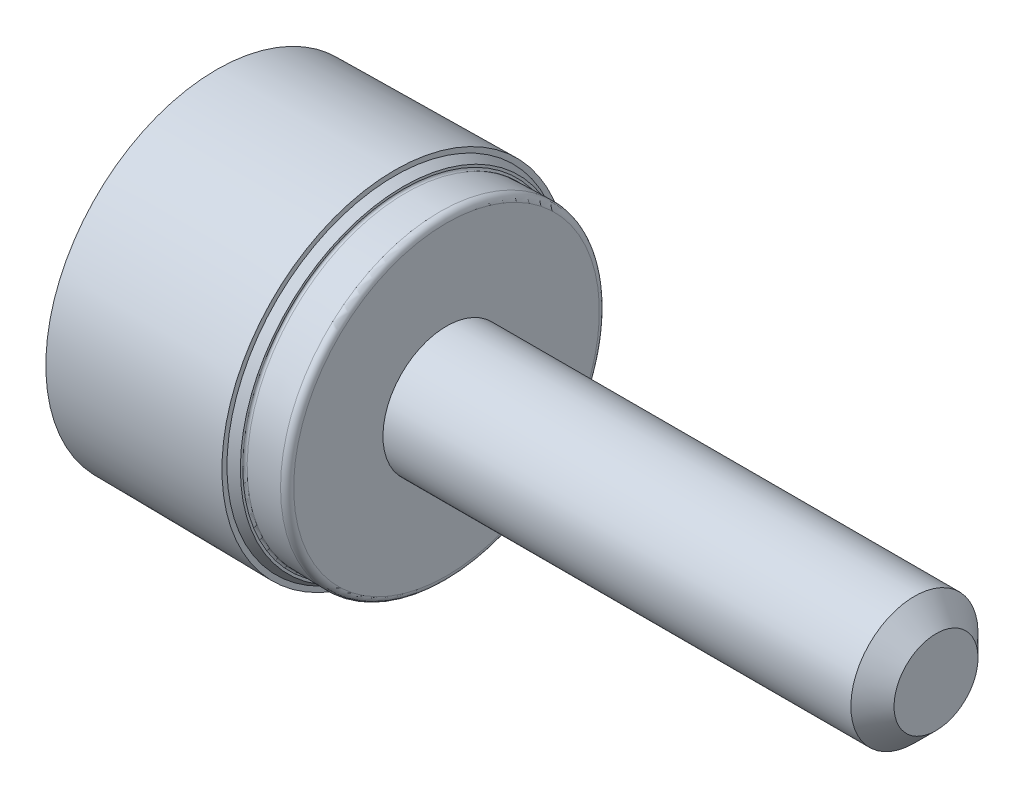
ISO-10303-21;
HEADER;
FILE_DESCRIPTION(('STEP AP214'),'2;1');
FILE_NAME('part.step','',(''),(''),'','','');
FILE_SCHEMA(('AUTOMOTIVE_DESIGN { 1 0 10303 214 1 1 1 1 }'));
ENDSEC;
DATA;
#1=APPLICATION_CONTEXT('core data for automotive mechanical design processes');
#2=APPLICATION_PROTOCOL_DEFINITION('international standard','automotive_design',2000,#1);
#3=PRODUCT_CONTEXT('',#1,'mechanical');
#4=PRODUCT('Part','Part','',(#3));
#5=PRODUCT_RELATED_PRODUCT_CATEGORY('part','',(#4));
#6=PRODUCT_DEFINITION_FORMATION('','',#4);
#7=PRODUCT_DEFINITION_CONTEXT('part definition',#1,'design');
#8=PRODUCT_DEFINITION('design','',#6,#7);
#9=PRODUCT_DEFINITION_SHAPE('','',#8);
#10=(LENGTH_UNIT() NAMED_UNIT(*) SI_UNIT(.MILLI.,.METRE.));
#11=(NAMED_UNIT(*) PLANE_ANGLE_UNIT() SI_UNIT($,.RADIAN.));
#12=(NAMED_UNIT(*) SI_UNIT($,.STERADIAN.) SOLID_ANGLE_UNIT());
#13=UNCERTAINTY_MEASURE_WITH_UNIT(LENGTH_MEASURE(1.E-05),#10,'distance_accuracy_value','');
#14=(GEOMETRIC_REPRESENTATION_CONTEXT(3) GLOBAL_UNCERTAINTY_ASSIGNED_CONTEXT((#13)) GLOBAL_UNIT_ASSIGNED_CONTEXT((#10,
#11,#12)) REPRESENTATION_CONTEXT('',''));
#15=CARTESIAN_POINT('',(0.,0.,0.));
#16=DIRECTION('',(0.,0.,1.));
#17=DIRECTION('',(1.,0.,0.));
#18=AXIS2_PLACEMENT_3D('',#15,#16,#17);
#19=CARTESIAN_POINT('',(-10.702925,2.8702,0.));
#20=DIRECTION('',(1.,0.,0.));
#21=DIRECTION('',(0.,1.,0.));
#22=AXIS2_PLACEMENT_3D('',#19,#20,#21);
#23=PLANE('',#22);
#24=CARTESIAN_POINT('',(-10.702925,0.,0.));
#25=DIRECTION('',(-1.,0.,0.));
#26=DIRECTION('',(0.,-1.,0.));
#27=AXIS2_PLACEMENT_3D('',#24,#25,#26);
#28=CIRCLE('',#27,4.70846566463158);
#29=CARTESIAN_POINT('',(-10.702925,-4.70846566463158,0.));
#30=VERTEX_POINT('',#29);
#31=EDGE_CURVE('E53',#30,#30,#28,.T.);
#32=ORIENTED_EDGE('',*,*,#31,.T.);
#33=EDGE_LOOP('',(#32));
#34=FACE_BOUND('',#33,.T.);
#35=ADVANCED_FACE('F38',(#34),#23,.F.);
#36=CARTESIAN_POINT('',(-5.794375,0.,0.));
#37=DIRECTION('',(1.,0.,0.));
#38=DIRECTION('',(0.,1.,0.));
#39=AXIS2_PLACEMENT_3D('',#36,#37,#38);
#40=CONICAL_SURFACE('',#39,4.7625,0.0110077625549129);
#41=ORIENTED_EDGE('',*,*,#31,.F.);
#42=EDGE_LOOP('',(#41));
#43=FACE_BOUND('',#42,.T.);
#44=CARTESIAN_POINT('',(-5.794375,0.,0.));
#45=DIRECTION('',(-1.,0.,0.));
#46=DIRECTION('',(0.,-1.,0.));
#47=AXIS2_PLACEMENT_3D('',#44,#45,#46);
#48=CIRCLE('',#47,4.7625);
#49=CARTESIAN_POINT('',(-5.794375,-4.7625,0.));
#50=VERTEX_POINT('',#49);
#51=EDGE_CURVE('E58',#50,#50,#48,.T.);
#52=ORIENTED_EDGE('',*,*,#51,.T.);
#53=EDGE_LOOP('',(#52));
#54=FACE_BOUND('',#53,.T.);
#55=ADVANCED_FACE('F99',(#43,#54),#40,.T.);
#56=CARTESIAN_POINT('',(-5.794375,4.7625,0.));
#57=DIRECTION('',(-1.,0.,0.));
#58=DIRECTION('',(0.,-1.,0.));
#59=AXIS2_PLACEMENT_3D('',#56,#57,#58);
#60=PLANE('',#59);
#61=ORIENTED_EDGE('',*,*,#51,.F.);
#62=EDGE_LOOP('',(#61));
#63=FACE_BOUND('',#62,.T.);
#64=CARTESIAN_POINT('',(-5.794375,0.,0.));
#65=DIRECTION('',(-1.,0.,0.));
#66=DIRECTION('',(0.,-1.,0.));
#67=AXIS2_PLACEMENT_3D('',#64,#65,#66);
#68=CIRCLE('',#67,4.62501846714922);
#69=CARTESIAN_POINT('',(-5.794375,-4.62501846714922,0.));
#70=VERTEX_POINT('',#69);
#71=EDGE_CURVE('E61',#70,#70,#68,.T.);
#72=ORIENTED_EDGE('',*,*,#71,.T.);
#73=EDGE_LOOP('',(#72));
#74=FACE_BOUND('',#73,.T.);
#75=ADVANCED_FACE('F104',(#63,#74),#60,.F.);
#76=CARTESIAN_POINT('',(-5.55625,0.,0.));
#77=DIRECTION('',(-1.,0.,0.));
#78=DIRECTION('',(0.,-1.,0.));
#79=AXIS2_PLACEMENT_3D('',#76,#77,#78);
#80=CONICAL_SURFACE('',#79,4.49302362427203,0.506145483078355);
#81=ORIENTED_EDGE('',*,*,#71,.F.);
#82=EDGE_LOOP('',(#81));
#83=FACE_BOUND('',#82,.T.);
#84=CARTESIAN_POINT('',(-5.55625,0.,0.));
#85=DIRECTION('',(-1.,0.,0.));
#86=DIRECTION('',(0.,-1.,0.));
#87=AXIS2_PLACEMENT_3D('',#84,#85,#86);
#88=CIRCLE('',#87,4.49302362427203);
#89=CARTESIAN_POINT('',(-5.55625,-4.49302362427203,0.));
#90=VERTEX_POINT('',#89);
#91=EDGE_CURVE('E64',#90,#90,#88,.T.);
#92=ORIENTED_EDGE('',*,*,#91,.T.);
#93=EDGE_LOOP('',(#92));
#94=FACE_BOUND('',#93,.T.);
#95=ADVANCED_FACE('F110',(#83,#94),#80,.T.);
#96=CARTESIAN_POINT('',(-5.55625,4.42689467953474,0.));
#97=DIRECTION('',(-1.,0.,0.));
#98=DIRECTION('',(0.,-1.,0.));
#99=AXIS2_PLACEMENT_3D('',#96,#97,#98);
#100=PLANE('',#99);
#101=ORIENTED_EDGE('',*,*,#91,.F.);
#102=EDGE_LOOP('',(#101));
#103=FACE_BOUND('',#102,.T.);
#104=CARTESIAN_POINT('',(-5.55625,0.,0.));
#105=DIRECTION('',(-1.,0.,0.));
#106=DIRECTION('',(0.,-1.,0.));
#107=AXIS2_PLACEMENT_3D('',#104,#105,#106);
#108=CIRCLE('',#107,4.42689467953474);
#109=CARTESIAN_POINT('',(-5.55625,-4.42689467953474,0.));
#110=VERTEX_POINT('',#109);
#111=EDGE_CURVE('E67',#110,#110,#108,.T.);
#112=ORIENTED_EDGE('',*,*,#111,.T.);
#113=EDGE_LOOP('',(#112));
#114=FACE_BOUND('',#113,.T.);
#115=ADVANCED_FACE('F114',(#103,#114),#100,.F.);
#116=CARTESIAN_POINT('',(-5.49656372070206,0.,0.));
#117=DIRECTION('',(-1.,0.,0.));
#118=DIRECTION('',(0.,-1.,0.));
#119=AXIS2_PLACEMENT_3D('',#116,#117,#118);
#120=TOROIDAL_SURFACE('',#119,4.42689467953474,0.0596862792979329);
#121=ORIENTED_EDGE('',*,*,#111,.F.);
#122=EDGE_LOOP('',(#121));
#123=FACE_BOUND('',#122,.T.);
#124=CARTESIAN_POINT('',(-5.49500131605419,0.,0.));
#125=DIRECTION('',(-1.,0.,0.));
#126=DIRECTION('',(0.,-1.,0.));
#127=AXIS2_PLACEMENT_3D('',#124,#125,#126);
#128=CIRCLE('',#127,4.36722885323402);
#129=CARTESIAN_POINT('',(-5.49500131605419,-4.36722885323402,0.));
#130=VERTEX_POINT('',#129);
#131=EDGE_CURVE('E70',#130,#130,#128,.T.);
#132=ORIENTED_EDGE('',*,*,#131,.T.);
#133=EDGE_LOOP('',(#132));
#134=FACE_BOUND('',#133,.T.);
#135=ADVANCED_FACE('F118',(#123,#134),#120,.F.);
#136=CARTESIAN_POINT('',(-4.54937105183742,0.,0.));
#137=DIRECTION('',(1.,0.,0.));
#138=DIRECTION('',(0.,1.,0.));
#139=AXIS2_PLACEMENT_3D('',#136,#137,#138);
#140=CONICAL_SURFACE('',#139,4.39199105316625,0.0261799387799148);
#141=ORIENTED_EDGE('',*,*,#131,.F.);
#142=EDGE_LOOP('',(#141));
#143=FACE_BOUND('',#142,.T.);
#144=CARTESIAN_POINT('',(-4.54937105183742,0.,0.));
#145=DIRECTION('',(-1.,0.,0.));
#146=DIRECTION('',(0.,-1.,0.));
#147=AXIS2_PLACEMENT_3D('',#144,#145,#146);
#148=CIRCLE('',#147,4.39199105316625);
#149=CARTESIAN_POINT('',(-4.54937105183742,-4.39199105316625,0.));
#150=VERTEX_POINT('',#149);
#151=EDGE_CURVE('E73',#150,#150,#148,.T.);
#152=ORIENTED_EDGE('',*,*,#151,.T.);
#153=EDGE_LOOP('',(#152));
#154=FACE_BOUND('',#153,.T.);
#155=ADVANCED_FACE('F93',(#143,#154),#140,.T.);
#156=CARTESIAN_POINT('',(-4.5446838378938,0.,0.));
#157=DIRECTION('',(-1.,0.,0.));
#158=DIRECTION('',(0.,-1.,0.));
#159=AXIS2_PLACEMENT_3D('',#156,#157,#158);
#160=TOROIDAL_SURFACE('',#159,4.2129935742641,0.179058837893799);
#161=ORIENTED_EDGE('',*,*,#151,.F.);
#162=EDGE_LOOP('',(#161));
#163=FACE_BOUND('',#162,.T.);
#164=CARTESIAN_POINT('',(-4.365625,0.,0.));
#165=DIRECTION('',(-1.,0.,0.));
#166=DIRECTION('',(0.,-1.,0.));
#167=AXIS2_PLACEMENT_3D('',#164,#165,#166);
#168=CIRCLE('',#167,4.2129935742641);
#169=CARTESIAN_POINT('',(-4.365625,-4.2129935742641,0.));
#170=VERTEX_POINT('',#169);
#171=EDGE_CURVE('E76',#170,#170,#168,.T.);
#172=ORIENTED_EDGE('',*,*,#171,.T.);
#173=EDGE_LOOP('',(#172));
#174=FACE_BOUND('',#173,.T.);
#175=ADVANCED_FACE('F80',(#163,#174),#160,.T.);
#176=CARTESIAN_POINT('',(-4.365625,4.2129935742641,0.));
#177=DIRECTION('',(-1.,0.,0.));
#178=DIRECTION('',(0.,-1.,0.));
#179=AXIS2_PLACEMENT_3D('',#176,#177,#178);
#180=PLANE('',#179);
#181=CARTESIAN_POINT('',(-4.365625,0.,0.));
#182=DIRECTION('',(-1.,0.,0.));
#183=DIRECTION('',(0.,-1.,0.));
#184=AXIS2_PLACEMENT_3D('',#181,#182,#183);
#185=CIRCLE('',#184,1.7526);
#186=CARTESIAN_POINT('',(-4.365625,-1.75260000000001,0.));
#187=VERTEX_POINT('',#186);
#188=EDGE_CURVE('E49',#187,#187,#185,.F.);
#189=ORIENTED_EDGE('',*,*,#188,.F.);
#190=EDGE_LOOP('',(#189));
#191=FACE_BOUND('',#190,.T.);
#192=ORIENTED_EDGE('',*,*,#171,.F.);
#193=EDGE_LOOP('',(#192));
#194=FACE_BOUND('',#193,.T.);
#195=ADVANCED_FACE('F82',(#191,#194),#180,.F.);
#196=CARTESIAN_POINT('',(9.128125,1.7526,0.));
#197=DIRECTION('',(-1.,0.,0.));
#198=DIRECTION('',(0.,-1.,0.));
#199=AXIS2_PLACEMENT_3D('',#196,#197,#198);
#200=PLANE('',#199);
#201=CARTESIAN_POINT('',(9.128125,0.,0.));
#202=DIRECTION('',(-1.,0.,0.));
#203=DIRECTION('',(0.,-1.,0.));
#204=AXIS2_PLACEMENT_3D('',#201,#202,#203);
#205=CIRCLE('',#204,1.1572875);
#206=CARTESIAN_POINT('',(9.128125,-1.15728750000001,0.));
#207=VERTEX_POINT('',#206);
#208=EDGE_CURVE('E10',#207,#207,#205,.F.);
#209=ORIENTED_EDGE('',*,*,#208,.T.);
#210=EDGE_LOOP('',(#209));
#211=FACE_BOUND('',#210,.T.);
#212=ADVANCED_FACE('F84',(#211),#200,.F.);
#213=CARTESIAN_POINT('',(-10.702925,0.,0.));
#214=DIRECTION('',(-1.,0.,0.));
#215=DIRECTION('',(0.,-1.,0.));
#216=AXIS2_PLACEMENT_3D('',#213,#214,#215);
#217=CYLINDRICAL_SURFACE('',#216,1.7526);
#218=CARTESIAN_POINT('',(8.5328125,0.,0.));
#219=DIRECTION('',(-1.,0.,0.));
#220=DIRECTION('',(0.,-1.,0.));
#221=AXIS2_PLACEMENT_3D('',#218,#219,#220);
#222=CIRCLE('',#221,1.7526);
#223=CARTESIAN_POINT('',(8.5328125,-1.75260000000001,0.));
#224=VERTEX_POINT('',#223);
#225=EDGE_CURVE('E45',#224,#224,#222,.T.);
#226=ORIENTED_EDGE('',*,*,#225,.T.);
#227=EDGE_LOOP('',(#226));
#228=FACE_BOUND('',#227,.T.);
#229=ORIENTED_EDGE('',*,*,#188,.T.);
#230=EDGE_LOOP('',(#229));
#231=FACE_BOUND('',#230,.T.);
#232=ADVANCED_FACE('F91',(#228,#231),#217,.T.);
#233=CARTESIAN_POINT('',(8.5328125,0.,0.));
#234=DIRECTION('',(-1.,0.,0.));
#235=DIRECTION('',(0.,-1.,0.));
#236=AXIS2_PLACEMENT_3D('',#233,#234,#235);
#237=CONICAL_SURFACE('',#236,1.7526,0.785398163397448);
#238=ORIENTED_EDGE('',*,*,#208,.F.);
#239=EDGE_LOOP('',(#238));
#240=FACE_BOUND('',#239,.T.);
#241=ORIENTED_EDGE('',*,*,#225,.F.);
#242=EDGE_LOOP('',(#241));
#243=FACE_BOUND('',#242,.T.);
#244=ADVANCED_FACE('F40',(#240,#243),#237,.T.);
#245=CLOSED_SHELL('',(#35,#55,#75,#95,#115,#135,#155,#175,#195,#212,#232,#244));
#246=MANIFOLD_SOLID_BREP('B2',#245);
#247=ADVANCED_BREP_SHAPE_REPRESENTATION('',(#18,#246),#14);
#248=SHAPE_DEFINITION_REPRESENTATION(#9,#247);
ENDSEC;
END-ISO-10303-21;
